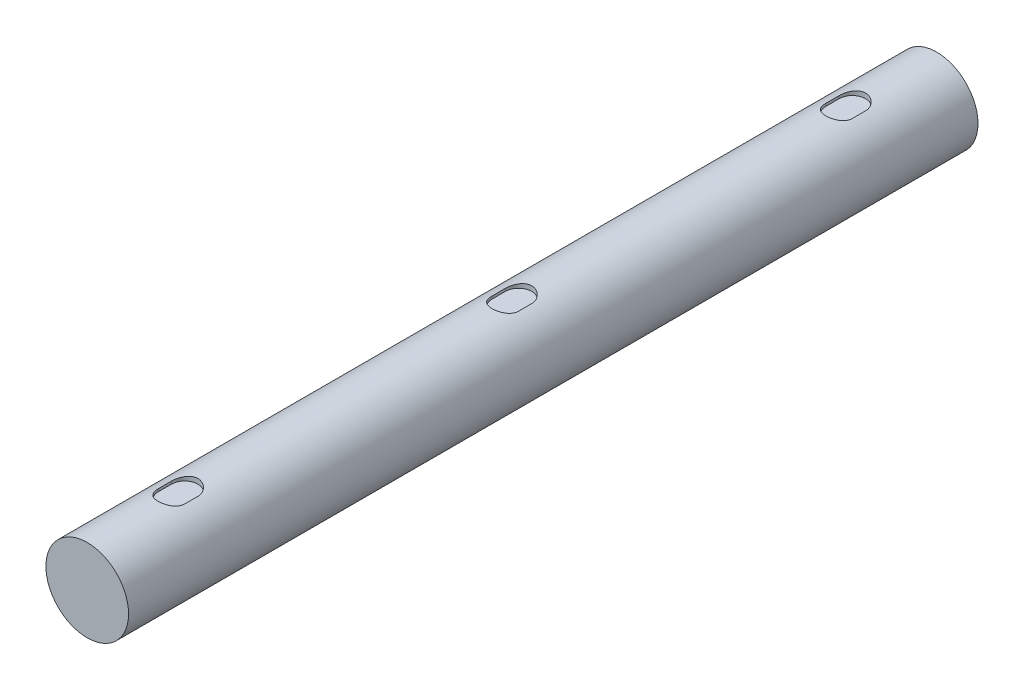
ISO-10303-21;
HEADER;
FILE_DESCRIPTION(('STEP AP214'),'2;1');
FILE_NAME('part.step','',(''),(''),'','','');
FILE_SCHEMA(('AUTOMOTIVE_DESIGN { 1 0 10303 214 1 1 1 1 }'));
ENDSEC;
DATA;
#1=APPLICATION_CONTEXT('core data for automotive mechanical design processes');
#2=APPLICATION_PROTOCOL_DEFINITION('international standard','automotive_design',2000,#1);
#3=PRODUCT_CONTEXT('',#1,'mechanical');
#4=PRODUCT('Part','Part','',(#3));
#5=PRODUCT_RELATED_PRODUCT_CATEGORY('part','',(#4));
#6=PRODUCT_DEFINITION_FORMATION('','',#4);
#7=PRODUCT_DEFINITION_CONTEXT('part definition',#1,'design');
#8=PRODUCT_DEFINITION('design','',#6,#7);
#9=PRODUCT_DEFINITION_SHAPE('','',#8);
#10=(LENGTH_UNIT() NAMED_UNIT(*) SI_UNIT(.MILLI.,.METRE.));
#11=(NAMED_UNIT(*) PLANE_ANGLE_UNIT() SI_UNIT($,.RADIAN.));
#12=(NAMED_UNIT(*) SI_UNIT($,.STERADIAN.) SOLID_ANGLE_UNIT());
#13=UNCERTAINTY_MEASURE_WITH_UNIT(LENGTH_MEASURE(1.E-05),#10,'distance_accuracy_value','');
#14=(GEOMETRIC_REPRESENTATION_CONTEXT(3) GLOBAL_UNCERTAINTY_ASSIGNED_CONTEXT((#13)) GLOBAL_UNIT_ASSIGNED_CONTEXT((#10,
#11,#12)) REPRESENTATION_CONTEXT('',''));
#15=CARTESIAN_POINT('',(0.,0.,0.));
#16=DIRECTION('',(0.,0.,1.));
#17=DIRECTION('',(1.,0.,0.));
#18=AXIS2_PLACEMENT_3D('',#15,#16,#17);
#19=CARTESIAN_POINT('',(0.,0.,257.));
#20=DIRECTION('',(0.,0.,-1.));
#21=DIRECTION('',(-1.,0.,0.));
#22=AXIS2_PLACEMENT_3D('',#19,#20,#21);
#23=CYLINDRICAL_SURFACE('',#22,12.5);
#24=CARTESIAN_POINT('',(0.,0.,0.));
#25=DIRECTION('',(0.,0.,1.));
#26=DIRECTION('',(1.,0.,0.));
#27=AXIS2_PLACEMENT_3D('',#24,#25,#26);
#28=CIRCLE('',#27,12.5);
#29=CARTESIAN_POINT('',(12.5,0.,0.));
#30=VERTEX_POINT('',#29);
#31=EDGE_CURVE('E169',#30,#30,#28,.T.);
#32=ORIENTED_EDGE('',*,*,#31,.T.);
#33=EDGE_LOOP('',(#32));
#34=FACE_BOUND('',#33,.T.);
#35=CARTESIAN_POINT('',(0.,0.,257.));
#36=DIRECTION('',(0.,0.,1.));
#37=DIRECTION('',(1.,0.,0.));
#38=AXIS2_PLACEMENT_3D('',#35,#36,#37);
#39=CIRCLE('',#38,12.5);
#40=CARTESIAN_POINT('',(12.5,0.,257.));
#41=VERTEX_POINT('',#40);
#42=EDGE_CURVE('E195',#41,#41,#39,.T.);
#43=ORIENTED_EDGE('',*,*,#42,.F.);
#44=EDGE_LOOP('',(#43));
#45=FACE_BOUND('',#44,.T.);
#46=CARTESIAN_POINT('',(-4.,11.842719282327,130.5));
#47=CARTESIAN_POINT('',(-4.00001410484613,11.8427027366058,130.609399771962));
#48=CARTESIAN_POINT('',(-3.995512175201,11.8442348052368,130.718790209848));
#49=CARTESIAN_POINT('',(-3.97758606678449,11.8502730910574,130.936728240737));
#50=CARTESIAN_POINT('',(-3.9641641287257,11.8547785613244,131.045276038485));
#51=CARTESIAN_POINT('',(-3.92855725119429,11.8666242076309,131.260461030845));
#52=CARTESIAN_POINT('',(-3.9063967602145,11.8739564736691,131.367102695611));
#53=CARTESIAN_POINT('',(-3.85353581488656,11.8912164993788,131.578005638372));
#54=CARTESIAN_POINT('',(-3.82283508754056,11.90114434202,131.682266840157));
#55=CARTESIAN_POINT('',(-3.71831764495513,11.9343840843196,131.990305004278));
#56=CARTESIAN_POINT('',(-3.63203544139889,11.9611699822066,132.189636552068));
#57=CARTESIAN_POINT('',(-3.4289502119229,12.0209583955878,132.571012557042));
#58=CARTESIAN_POINT('',(-3.31213030924912,12.0539643457894,132.75304737905));
#59=CARTESIAN_POINT('',(-3.04678507884792,12.123798407807,133.101253988599));
#60=CARTESIAN_POINT('',(-2.89735303896516,12.1607158548651,133.266718324339));
#61=CARTESIAN_POINT('',(-2.57296449846118,12.2334561140966,133.570714848589));
#62=CARTESIAN_POINT('',(-2.39800356343233,12.2692787347869,133.709242348358));
#63=CARTESIAN_POINT('',(-2.02237003010512,12.3368244653945,133.958615198371));
#64=CARTESIAN_POINT('',(-1.82118394546976,12.3684294972003,134.06872195647));
#65=CARTESIAN_POINT('',(-1.40197197350369,12.4229251649937,134.253249495349));
#66=CARTESIAN_POINT('',(-1.18395091903582,12.4458182908278,134.327680473782));
#67=CARTESIAN_POINT('',(-0.744713961063376,12.4796767811416,134.436358864251));
#68=CARTESIAN_POINT('',(-0.523827920101166,12.4910030499338,134.47182493338));
#69=CARTESIAN_POINT('',(-0.0789648151746458,12.5017287122873,134.505432799042));
#70=CARTESIAN_POINT('',(0.145011564197635,12.5011307063103,134.503582733525));
#71=CARTESIAN_POINT('',(0.58109497443769,12.4883236673358,134.463401170729));
#72=CARTESIAN_POINT('',(0.793338226675241,12.4765355800409,134.426392232021));
#73=CARTESIAN_POINT('',(1.20842320012721,12.443194578958,134.319119448394));
#74=CARTESIAN_POINT('',(1.41126440871778,12.4216411334261,134.248853792567));
#75=CARTESIAN_POINT('',(1.80478548808183,12.3706364987475,134.076242157764));
#76=CARTESIAN_POINT('',(1.99528012693527,12.3410893067347,133.973503480131));
#77=CARTESIAN_POINT('',(2.35673113106229,12.2771965403044,133.739170950955));
#78=CARTESIAN_POINT('',(2.52768253275751,12.2428497517893,133.607569793597));
#79=CARTESIAN_POINT('',(2.8530451152822,12.1712409097156,133.312553468708));
#80=CARTESIAN_POINT('',(3.00641313381737,12.1339170352569,133.148003297408));
#81=CARTESIAN_POINT('',(3.28377291775701,12.0618172896256,132.795028099915));
#82=CARTESIAN_POINT('',(3.40775562728565,12.0270422062066,132.606595741168));
#83=CARTESIAN_POINT('',(3.56958208232606,11.9796198433082,132.308628762251));
#84=CARTESIAN_POINT('',(3.61975674493764,11.9645161845072,132.206000940758));
#85=CARTESIAN_POINT('',(3.71123075156254,11.9364591580623,131.996595247248));
#86=CARTESIAN_POINT('',(3.75253376401033,11.9235049021446,131.889819112214));
#87=CARTESIAN_POINT('',(3.82585831579177,11.9001802342949,131.672986672108));
#88=CARTESIAN_POINT('',(3.85788979915527,11.889807055759,131.562934022027));
#89=CARTESIAN_POINT('',(3.91241790563963,11.8719756673203,131.340304843052));
#90=CARTESIAN_POINT('',(3.93491889994975,11.8645161211931,131.227729496203));
#91=CARTESIAN_POINT('',(3.96832908530803,11.8533815888388,131.012760754139));
#92=CARTESIAN_POINT('',(3.9802038456482,11.8493925948395,130.910532584205));
#93=CARTESIAN_POINT('',(3.99603937127681,11.8440568016292,130.705538921967));
#94=CARTESIAN_POINT('',(4.00001099551563,11.8427063770563,130.602774361719));
#95=CARTESIAN_POINT('',(4.,11.842719282327,130.5));
#96=B_SPLINE_CURVE_WITH_KNOTS('',3,(#46,#47,#48,#49,#50,#51,#52,#53,#54,#55,#56,#57,#58,#59,#60,
#61,#62,#63,#64,#65,#66,#67,#68,#69,#70,#71,#72,#73,#74,#75,#76,#77,#78,#79,#80,#81,#82,#83,#84,
#85,#86,#87,#88,#89,#90,#91,#92,#93,#94,#95),.UNSPECIFIED.,.F.,.F.,(4,2,2,2,2,2,2,2,2,2,2,2,2,2,
2,2,2,2,2,2,2,2,2,2,4),(0.,0.328080176984138,0.656077971124964,0.983164539368214,
1.31026156448799,1.96355293984241,2.61720612481379,3.29209427898753,3.96709980211696,
4.65819584662372,5.34909422856991,6.01770820975084,6.68617638029993,7.3304550155383,
7.97476873730064,8.62719320105812,9.27978300073407,9.96076419384898,10.6419549776067,
10.9872862883783,11.3324745283028,11.6772911585126,12.0219494657669,12.3305938648258,
12.6388138912331),.UNSPECIFIED.);
#97=CARTESIAN_POINT('',(-4.,11.842719282327,130.5));
#98=VERTEX_POINT('',#97);
#99=CARTESIAN_POINT('',(4.,11.842719282327,130.5));
#100=VERTEX_POINT('',#99);
#101=EDGE_CURVE('E198',#98,#100,#96,.T.);
#102=ORIENTED_EDGE('',*,*,#101,.F.);
#103=DIRECTION('',(0.,0.,-1.));
#104=VECTOR('',#103,1.);
#105=CARTESIAN_POINT('',(-3.99999999999997,11.842719282327,257.));
#106=LINE('',#105,#104);
#107=CARTESIAN_POINT('',(-4.,11.842719282327,126.5));
#108=VERTEX_POINT('',#107);
#109=EDGE_CURVE('E234',#98,#108,#106,.T.);
#110=ORIENTED_EDGE('',*,*,#109,.T.);
#111=CARTESIAN_POINT('',(4.,11.842719282327,126.5));
#112=CARTESIAN_POINT('',(4.00001410484613,11.8427027366058,126.390600228038));
#113=CARTESIAN_POINT('',(3.995512175201,11.8442348052368,126.281209790152));
#114=CARTESIAN_POINT('',(3.97758606678449,11.8502730910574,126.063271759263));
#115=CARTESIAN_POINT('',(3.9641641287257,11.8547785613244,125.954723961515));
#116=CARTESIAN_POINT('',(3.92855725119429,11.8666242076309,125.739538969154));
#117=CARTESIAN_POINT('',(3.90639676021449,11.8739564736692,125.632897304389));
#118=CARTESIAN_POINT('',(3.85353581488655,11.8912164993788,125.421994361628));
#119=CARTESIAN_POINT('',(3.82283508754055,11.90114434202,125.317733159843));
#120=CARTESIAN_POINT('',(3.71831764495512,11.9343840843196,125.009694995722));
#121=CARTESIAN_POINT('',(3.63203544139887,11.9611699822066,124.810363447932));
#122=CARTESIAN_POINT('',(3.42895021192288,12.0209583955878,124.428987442958));
#123=CARTESIAN_POINT('',(3.31213030924909,12.0539643457894,124.24695262095));
#124=CARTESIAN_POINT('',(3.0467850788479,12.123798407807,123.898746011401));
#125=CARTESIAN_POINT('',(2.89735303896514,12.1607158548651,123.733281675661));
#126=CARTESIAN_POINT('',(2.57296449846117,12.2334561140966,123.429285151411));
#127=CARTESIAN_POINT('',(2.39800356343233,12.2692787347869,123.290757651642));
#128=CARTESIAN_POINT('',(2.02237003010513,12.3368244653945,123.041384801629));
#129=CARTESIAN_POINT('',(1.82118394546977,12.3684294972003,122.93127804353));
#130=CARTESIAN_POINT('',(1.4019719735037,12.4229251649937,122.746750504651));
#131=CARTESIAN_POINT('',(1.18395091903582,12.4458182908278,122.672319526218));
#132=CARTESIAN_POINT('',(0.744713961063371,12.4796767811416,122.56364113575));
#133=CARTESIAN_POINT('',(0.523827920101163,12.4910030499338,122.52817506662));
#134=CARTESIAN_POINT('',(0.0789648151746441,12.5017287122873,122.494567200958));
#135=CARTESIAN_POINT('',(-0.145011564197637,12.5011307063103,122.496417266475));
#136=CARTESIAN_POINT('',(-0.581094974437685,12.4883236673358,122.536598829271));
#137=CARTESIAN_POINT('',(-0.793338226675229,12.4765355800409,122.573607767979));
#138=CARTESIAN_POINT('',(-1.2084232001272,12.443194578958,122.680880551606));
#139=CARTESIAN_POINT('',(-1.41126440871777,12.4216411334261,122.751146207433));
#140=CARTESIAN_POINT('',(-1.80478548808183,12.3706364987475,122.923757842236));
#141=CARTESIAN_POINT('',(-1.99528012693527,12.3410893067347,123.026496519869));
#142=CARTESIAN_POINT('',(-2.35673113106228,12.2771965403044,123.260829049045));
#143=CARTESIAN_POINT('',(-2.5276825327575,12.2428497517893,123.392430206403));
#144=CARTESIAN_POINT('',(-2.8530451152822,12.1712409097156,123.687446531292));
#145=CARTESIAN_POINT('',(-3.00641313381737,12.1339170352569,123.851996702592));
#146=CARTESIAN_POINT('',(-3.28377291775701,12.0618172896256,124.204971900085));
#147=CARTESIAN_POINT('',(-3.40775562728565,12.0270422062066,124.393404258832));
#148=CARTESIAN_POINT('',(-3.56958208232606,11.9796198433082,124.691371237749));
#149=CARTESIAN_POINT('',(-3.61975674493764,11.9645161845072,124.793999059242));
#150=CARTESIAN_POINT('',(-3.71123075156254,11.9364591580623,125.003404752752));
#151=CARTESIAN_POINT('',(-3.75253376401033,11.9235049021446,125.110180887786));
#152=CARTESIAN_POINT('',(-3.82585831579178,11.9001802342949,125.327013327892));
#153=CARTESIAN_POINT('',(-3.85788979915528,11.889807055759,125.437065977973));
#154=CARTESIAN_POINT('',(-3.91241790563964,11.8719756673203,125.659695156948));
#155=CARTESIAN_POINT('',(-3.93491889994975,11.8645161211931,125.772270503797));
#156=CARTESIAN_POINT('',(-3.96832908530803,11.8533815888388,125.987239245861));
#157=CARTESIAN_POINT('',(-3.9802038456482,11.8493925948395,126.089467415795));
#158=CARTESIAN_POINT('',(-3.99603937127681,11.8440568016292,126.294461078033));
#159=CARTESIAN_POINT('',(-4.00001099551563,11.8427063770563,126.397225638281));
#160=CARTESIAN_POINT('',(-4.,11.842719282327,126.5));
#161=B_SPLINE_CURVE_WITH_KNOTS('',3,(#111,#112,#113,#114,#115,#116,#117,#118,#119,#120,#121,
#122,#123,#124,#125,#126,#127,#128,#129,#130,#131,#132,#133,#134,#135,#136,#137,#138,#139,#140,
#141,#142,#143,#144,#145,#146,#147,#148,#149,#150,#151,#152,#153,#154,#155,#156,#157,#158,#159,
#160),.UNSPECIFIED.,.F.,.F.,(4,2,2,2,2,2,2,2,2,2,2,2,2,2,2,2,2,2,2,2,2,2,2,2,4),(0.,
0.328080176984138,0.656077971124964,0.983164539368271,1.31026156448799,1.96355293984249,
2.61720612481382,3.29209427898755,3.96709980211696,4.65819584662372,5.34909422856992,
6.01770820975085,6.68617638029993,7.33045501553829,7.97476873730064,8.62719320105811,
9.27978300073407,9.96076419384898,10.6419549776068,10.9872862883783,11.3324745283028,
11.6772911585126,12.0219494657669,12.3305938648259,12.6388138912331),.UNSPECIFIED.);
#162=CARTESIAN_POINT('',(4.,11.842719282327,126.5));
#163=VERTEX_POINT('',#162);
#164=EDGE_CURVE('E228',#163,#108,#161,.T.);
#165=ORIENTED_EDGE('',*,*,#164,.F.);
#166=DIRECTION('',(0.,0.,-1.));
#167=VECTOR('',#166,1.);
#168=CARTESIAN_POINT('',(4.00000000000003,11.842719282327,257.));
#169=LINE('',#168,#167);
#170=EDGE_CURVE('E207',#100,#163,#169,.T.);
#171=ORIENTED_EDGE('',*,*,#170,.F.);
#172=EDGE_LOOP('',(#102,#110,#165,#171));
#173=FACE_BOUND('',#172,.T.);
#174=CARTESIAN_POINT('',(-4.,11.842719282327,25.5));
#175=CARTESIAN_POINT('',(-4.00001410484613,11.8427027366058,25.3906002280384));
#176=CARTESIAN_POINT('',(-3.995512175201,11.8442348052368,25.2812097901521));
#177=CARTESIAN_POINT('',(-3.97758606678449,11.8502730910574,25.0632717592635));
#178=CARTESIAN_POINT('',(-3.96416412872571,11.8547785613244,24.9547239615155));
#179=CARTESIAN_POINT('',(-3.92855725119429,11.8666242076309,24.7395389691545));
#180=CARTESIAN_POINT('',(-3.9063967602145,11.8739564736691,24.6328973043888));
#181=CARTESIAN_POINT('',(-3.85353581488656,11.8912164993788,24.4219943616284));
#182=CARTESIAN_POINT('',(-3.82283508754056,11.90114434202,24.3177331598432));
#183=CARTESIAN_POINT('',(-3.71831764495512,11.9343840843196,24.0096949957216));
#184=CARTESIAN_POINT('',(-3.63203544139887,11.9611699822066,23.810363447932));
#185=CARTESIAN_POINT('',(-3.42895021192288,12.0209583955878,23.4289874429582));
#186=CARTESIAN_POINT('',(-3.31213030924909,12.0539643457894,23.2469526209503));
#187=CARTESIAN_POINT('',(-3.0467850788479,12.123798407807,22.8987460114008));
#188=CARTESIAN_POINT('',(-2.89735303896514,12.1607158548651,22.7332816756605));
#189=CARTESIAN_POINT('',(-2.57296449846116,12.2334561140966,22.4292851514111));
#190=CARTESIAN_POINT('',(-2.39800356343232,12.2692787347869,22.2907576516423));
#191=CARTESIAN_POINT('',(-2.02237003010512,12.3368244653945,22.0413848016295));
#192=CARTESIAN_POINT('',(-1.82118394546976,12.3684294972003,21.9312780435304));
#193=CARTESIAN_POINT('',(-1.40197197350368,12.4229251649937,21.7467505046506));
#194=CARTESIAN_POINT('',(-1.18395091903581,12.4458182908278,21.6723195262181));
#195=CARTESIAN_POINT('',(-0.744713961063363,12.4796767811416,21.5636411357495));
#196=CARTESIAN_POINT('',(-0.523827920101154,12.4910030499338,21.5281750666199));
#197=CARTESIAN_POINT('',(-0.0789648151746366,12.5017287122873,21.4945672009584));
#198=CARTESIAN_POINT('',(0.145011564197643,12.5011307063103,21.4964172664752));
#199=CARTESIAN_POINT('',(0.581094974437693,12.4883236673358,21.5365988292713));
#200=CARTESIAN_POINT('',(0.793338226675239,12.4765355800409,21.5736077679788));
#201=CARTESIAN_POINT('',(1.2084232001272,12.443194578958,21.6808805516063));
#202=CARTESIAN_POINT('',(1.41126440871778,12.4216411334261,21.7511462074328));
#203=CARTESIAN_POINT('',(1.80478548808183,12.3706364987475,21.9237578422358));
#204=CARTESIAN_POINT('',(1.99528012693527,12.3410893067347,22.0264965198688));
#205=CARTESIAN_POINT('',(2.35673113106229,12.2771965403044,22.2608290490452));
#206=CARTESIAN_POINT('',(2.5276825327575,12.2428497517893,22.392430206403));
#207=CARTESIAN_POINT('',(2.85304511528221,12.1712409097156,22.6874465312916));
#208=CARTESIAN_POINT('',(3.00641313381737,12.1339170352569,22.8519967025921));
#209=CARTESIAN_POINT('',(3.28377291775701,12.0618172896256,23.2049719000853));
#210=CARTESIAN_POINT('',(3.40775562728565,12.0270422062066,23.3934042588321));
#211=CARTESIAN_POINT('',(3.56958208232607,11.9796198433082,23.6913712377486));
#212=CARTESIAN_POINT('',(3.61975674493765,11.9645161845072,23.7939990592415));
#213=CARTESIAN_POINT('',(3.71123075156255,11.9364591580623,24.0034047527517));
#214=CARTESIAN_POINT('',(3.75253376401034,11.9235049021446,24.1101808877864));
#215=CARTESIAN_POINT('',(3.82585831579179,11.9001802342949,24.3270133278916));
#216=CARTESIAN_POINT('',(3.85788979915529,11.889807055759,24.4370659779731));
#217=CARTESIAN_POINT('',(3.91241790563964,11.8719756673203,24.6596951569476));
#218=CARTESIAN_POINT('',(3.93491889994975,11.8645161211931,24.7722705037974));
#219=CARTESIAN_POINT('',(3.96832908530803,11.8533815888388,24.987239245861));
#220=CARTESIAN_POINT('',(3.9802038456482,11.8493925948395,25.0894674157946));
#221=CARTESIAN_POINT('',(3.99603937127681,11.8440568016292,25.2944610780333));
#222=CARTESIAN_POINT('',(4.00001099551563,11.8427063770563,25.3972256382805));
#223=CARTESIAN_POINT('',(4.,11.842719282327,25.5));
#224=B_SPLINE_CURVE_WITH_KNOTS('',3,(#174,#175,#176,#177,#178,#179,#180,#181,#182,#183,#184,
#185,#186,#187,#188,#189,#190,#191,#192,#193,#194,#195,#196,#197,#198,#199,#200,#201,#202,#203,
#204,#205,#206,#207,#208,#209,#210,#211,#212,#213,#214,#215,#216,#217,#218,#219,#220,#221,#222,
#223),.UNSPECIFIED.,.F.,.F.,(4,2,2,2,2,2,2,2,2,2,2,2,2,2,2,2,2,2,2,2,2,2,2,2,4),(0.,
0.328080176984104,0.656077971124949,0.98316453936822,1.310261564488,1.96355293984248,
2.61720612481382,3.29209427898756,3.96709980211697,4.65819584662373,5.34909422856993,
6.01770820975085,6.68617638029993,7.3304550155383,7.97476873730064,8.6271932010581,
9.27978300073407,9.96076419384897,10.6419549776068,10.9872862883783,11.3324745283028,
11.6772911585126,12.0219494657669,12.3305938648259,12.6388138912331),.UNSPECIFIED.);
#225=CARTESIAN_POINT('',(-4.,11.842719282327,25.5));
#226=VERTEX_POINT('',#225);
#227=CARTESIAN_POINT('',(4.,11.842719282327,25.5));
#228=VERTEX_POINT('',#227);
#229=EDGE_CURVE('E237',#226,#228,#224,.T.);
#230=ORIENTED_EDGE('',*,*,#229,.T.);
#231=DIRECTION('',(0.,0.,-1.));
#232=VECTOR('',#231,1.);
#233=CARTESIAN_POINT('',(4.,11.842719282327,257.));
#234=LINE('',#233,#232);
#235=CARTESIAN_POINT('',(4.,11.842719282327,29.5));
#236=VERTEX_POINT('',#235);
#237=EDGE_CURVE('E286',#228,#236,#234,.F.);
#238=ORIENTED_EDGE('',*,*,#237,.T.);
#239=CARTESIAN_POINT('',(4.,11.842719282327,29.5));
#240=CARTESIAN_POINT('',(4.00001410484613,11.8427027366058,29.6093997719616));
#241=CARTESIAN_POINT('',(3.995512175201,11.8442348052368,29.7187902098479));
#242=CARTESIAN_POINT('',(3.97758606678449,11.8502730910574,29.9367282407365));
#243=CARTESIAN_POINT('',(3.96416412872571,11.8547785613244,30.0452760384845));
#244=CARTESIAN_POINT('',(3.92855725119429,11.8666242076309,30.2604610308455));
#245=CARTESIAN_POINT('',(3.9063967602145,11.8739564736691,30.3671026956112));
#246=CARTESIAN_POINT('',(3.85353581488657,11.8912164993788,30.5780056383716));
#247=CARTESIAN_POINT('',(3.82283508754056,11.90114434202,30.6822668401568));
#248=CARTESIAN_POINT('',(3.71831764495512,11.9343840843196,30.9903050042784));
#249=CARTESIAN_POINT('',(3.63203544139888,11.9611699822066,31.189636552068));
#250=CARTESIAN_POINT('',(3.42895021192288,12.0209583955878,31.5710125570418));
#251=CARTESIAN_POINT('',(3.3121303092491,12.0539643457894,31.7530473790497));
#252=CARTESIAN_POINT('',(3.0467850788479,12.123798407807,32.1012539885992));
#253=CARTESIAN_POINT('',(2.89735303896514,12.1607158548651,32.2667183243395));
#254=CARTESIAN_POINT('',(2.57296449846116,12.2334561140966,32.5707148485889));
#255=CARTESIAN_POINT('',(2.39800356343233,12.2692787347869,32.7092423483577));
#256=CARTESIAN_POINT('',(2.02237003010512,12.3368244653945,32.9586151983705));
#257=CARTESIAN_POINT('',(1.82118394546977,12.3684294972003,33.0687219564696));
#258=CARTESIAN_POINT('',(1.40197197350369,12.4229251649937,33.2532494953494));
#259=CARTESIAN_POINT('',(1.18395091903581,12.4458182908278,33.3276804737819));
#260=CARTESIAN_POINT('',(0.744713961063364,12.4796767811416,33.4363588642505));
#261=CARTESIAN_POINT('',(0.523827920101156,12.4910030499338,33.4718249333801));
#262=CARTESIAN_POINT('',(0.0789648151746394,12.5017287122873,33.5054327990416));
#263=CARTESIAN_POINT('',(-0.14501156419764,12.5011307063103,33.5035827335248));
#264=CARTESIAN_POINT('',(-0.58109497443769,12.4883236673358,33.4634011707287));
#265=CARTESIAN_POINT('',(-0.793338226675237,12.4765355800409,33.4263922320212));
#266=CARTESIAN_POINT('',(-1.2084232001272,12.443194578958,33.3191194483937));
#267=CARTESIAN_POINT('',(-1.41126440871778,12.4216411334261,33.2488537925672));
#268=CARTESIAN_POINT('',(-1.80478548808183,12.3706364987475,33.0762421577642));
#269=CARTESIAN_POINT('',(-1.99528012693527,12.3410893067347,32.9735034801312));
#270=CARTESIAN_POINT('',(-2.35673113106228,12.2771965403044,32.7391709509548));
#271=CARTESIAN_POINT('',(-2.5276825327575,12.2428497517893,32.607569793597));
#272=CARTESIAN_POINT('',(-2.8530451152822,12.1712409097156,32.3125534687084));
#273=CARTESIAN_POINT('',(-3.00641313381737,12.1339170352569,32.1480032974079));
#274=CARTESIAN_POINT('',(-3.28377291775701,12.0618172896256,31.7950280999147));
#275=CARTESIAN_POINT('',(-3.40775562728565,12.0270422062066,31.6065957411679));
#276=CARTESIAN_POINT('',(-3.56958208232607,11.9796198433082,31.3086287622514));
#277=CARTESIAN_POINT('',(-3.61975674493765,11.9645161845072,31.2060009407585));
#278=CARTESIAN_POINT('',(-3.71123075156255,11.9364591580623,30.9965952472483));
#279=CARTESIAN_POINT('',(-3.75253376401034,11.9235049021446,30.8898191122136));
#280=CARTESIAN_POINT('',(-3.82585831579179,11.9001802342949,30.6729866721084));
#281=CARTESIAN_POINT('',(-3.85788979915529,11.889807055759,30.5629340220269));
#282=CARTESIAN_POINT('',(-3.91241790563964,11.8719756673203,30.3403048430524));
#283=CARTESIAN_POINT('',(-3.93491889994975,11.8645161211931,30.2277294962026));
#284=CARTESIAN_POINT('',(-3.96832908530803,11.8533815888388,30.012760754139));
#285=CARTESIAN_POINT('',(-3.9802038456482,11.8493925948395,29.9105325842054));
#286=CARTESIAN_POINT('',(-3.99603937127681,11.8440568016292,29.7055389219667));
#287=CARTESIAN_POINT('',(-4.00001099551563,11.8427063770563,29.6027743617195));
#288=CARTESIAN_POINT('',(-4.,11.842719282327,29.5));
#289=B_SPLINE_CURVE_WITH_KNOTS('',3,(#239,#240,#241,#242,#243,#244,#245,#246,#247,#248,#249,
#250,#251,#252,#253,#254,#255,#256,#257,#258,#259,#260,#261,#262,#263,#264,#265,#266,#267,#268,
#269,#270,#271,#272,#273,#274,#275,#276,#277,#278,#279,#280,#281,#282,#283,#284,#285,#286,#287,
#288),.UNSPECIFIED.,.F.,.F.,(4,2,2,2,2,2,2,2,2,2,2,2,2,2,2,2,2,2,2,2,2,2,2,2,4),(0.,
0.3280801769841,0.656077971124946,0.983164539368217,1.31026156448799,1.96355293984247,
2.61720612481382,3.29209427898755,3.96709980211696,4.65819584662373,5.34909422856993,
6.01770820975085,6.68617638029993,7.3304550155383,7.97476873730064,8.6271932010581,
9.27978300073407,9.96076419384897,10.6419549776068,10.9872862883783,11.3324745283028,
11.6772911585126,12.0219494657669,12.3305938648259,12.6388138912331),.UNSPECIFIED.);
#290=CARTESIAN_POINT('',(-4.,11.842719282327,29.5));
#291=VERTEX_POINT('',#290);
#292=EDGE_CURVE('E289',#236,#291,#289,.T.);
#293=ORIENTED_EDGE('',*,*,#292,.T.);
#294=DIRECTION('',(0.,0.,-1.));
#295=VECTOR('',#294,1.);
#296=CARTESIAN_POINT('',(-4.,11.842719282327,257.));
#297=LINE('',#296,#295);
#298=EDGE_CURVE('E245',#226,#291,#297,.F.);
#299=ORIENTED_EDGE('',*,*,#298,.F.);
#300=EDGE_LOOP('',(#230,#238,#293,#299));
#301=FACE_BOUND('',#300,.T.);
#302=DIRECTION('',(0.,0.,-1.));
#303=VECTOR('',#302,1.);
#304=CARTESIAN_POINT('',(4.,11.842719282327,257.));
#305=LINE('',#304,#303);
#306=CARTESIAN_POINT('',(4.,11.842719282327,231.5));
#307=VERTEX_POINT('',#306);
#308=CARTESIAN_POINT('',(4.,11.842719282327,227.5));
#309=VERTEX_POINT('',#308);
#310=EDGE_CURVE('E11',#307,#309,#305,.T.);
#311=ORIENTED_EDGE('',*,*,#310,.F.);
#312=CARTESIAN_POINT('',(0.,12.5,235.5));
#313=CARTESIAN_POINT('',(0.218739515789949,12.4999994635907,235.499999390874));
#314=CARTESIAN_POINT('',(0.437486592647652,12.4942046039089,235.481998511802));
#315=CARTESIAN_POINT('',(0.868567253093705,12.4716565543057,235.410670451177));
#316=CARTESIAN_POINT('',(1.08089965843427,12.454901363839,235.357336820455));
#317=CARTESIAN_POINT('',(1.49287306447891,12.4122595908852,235.217337696971));
#318=CARTESIAN_POINT('',(1.69253368346149,12.3863875511298,235.130725269074));
#319=CARTESIAN_POINT('',(2.0744969071279,12.3281725410718,234.926857924782));
#320=CARTESIAN_POINT('',(2.25679651756237,12.2958284575098,234.809597735586));
#321=CARTESIAN_POINT('',(2.60473689448744,12.2269266983455,234.54378971624));
#322=CARTESIAN_POINT('',(2.76974023061599,12.1902739433225,234.394432252616));
#323=CARTESIAN_POINT('',(3.07283559233071,12.1174266425772,234.070392333632));
#324=CARTESIAN_POINT('',(3.21092229484498,12.0812321888099,233.895704880863));
#325=CARTESIAN_POINT('',(3.45978487684573,12.012370269974,233.520367863724));
#326=CARTESIAN_POINT('',(3.56975307774838,11.9798196408788,233.319159296823));
#327=CARTESIAN_POINT('',(3.75402292836496,11.9233664449728,232.899894140575));
#328=CARTESIAN_POINT('',(3.82833449433394,11.8994614742253,232.681842255031));
#329=CARTESIAN_POINT('',(3.93682835778228,11.8640030689908,232.242293481816));
#330=CARTESIAN_POINT('',(3.97219742115686,11.8520853732299,232.021119745614));
#331=CARTESIAN_POINT('',(4.00551082647404,11.8408707762137,231.575681002044));
#332=CARTESIAN_POINT('',(4.00346567735333,11.8415703310132,231.35141688039));
#333=CARTESIAN_POINT('',(3.96293451839878,11.8551904771854,230.916086037751));
#334=CARTESIAN_POINT('',(3.92597105327877,11.8676004346024,230.704858866299));
#335=CARTESIAN_POINT('',(3.81912647431514,11.9024114349979,230.29177788886));
#336=CARTESIAN_POINT('',(3.74924170672462,11.9248135869381,230.089925126017));
#337=CARTESIAN_POINT('',(3.57749112898224,11.9774663544073,229.697755352963));
#338=CARTESIAN_POINT('',(3.47515682759627,12.0078307368189,229.507659450129));
#339=CARTESIAN_POINT('',(3.24173735834849,12.0729361214443,229.146844892426));
#340=CARTESIAN_POINT('',(3.110644420678,12.1076783053403,228.976131493139));
#341=CARTESIAN_POINT('',(2.8160137885106,12.1796593035711,228.650338317836));
#342=CARTESIAN_POINT('',(2.65122340623531,12.216938020211,228.496398057654));
#343=CARTESIAN_POINT('',(2.29770358054263,12.2883292028654,228.218053304415));
#344=CARTESIAN_POINT('',(2.10897218913167,12.3224414108409,228.093651217143));
#345=CARTESIAN_POINT('',(1.710653951781,12.3840447436164,227.8770913918));
#346=CARTESIAN_POINT('',(1.50090319860161,12.411477013699,227.785217247909));
#347=CARTESIAN_POINT('',(1.06783962590281,12.4562040275044,227.638401008343));
#348=CARTESIAN_POINT('',(0.844531157828867,12.4735020051158,227.583447130458));
#349=CARTESIAN_POINT('',(0.400354473973302,12.4954856059785,227.513999833337));
#350=CARTESIAN_POINT('',(0.179750715042687,12.5006515044539,227.497964815972));
#351=CARTESIAN_POINT('',(-0.261025673970267,12.4992163829611,227.502448045553));
#352=CARTESIAN_POINT('',(-0.481198365218603,12.4926171751051,227.522960663275));
#353=CARTESIAN_POINT('',(-0.908837545509531,12.4687095079374,227.598725282703));
#354=CARTESIAN_POINT('',(-1.11648590619505,12.4516871662316,227.653049775215));
#355=CARTESIAN_POINT('',(-1.51965413650145,12.4089396498837,227.793754498491));
#356=CARTESIAN_POINT('',(-1.71517248448531,12.3832133859887,227.880138741505));
#357=CARTESIAN_POINT('',(-2.09399230967611,12.3248882754976,228.084927542945));
#358=CARTESIAN_POINT('',(-2.27686405125241,12.2921331567523,228.204081279856));
#359=CARTESIAN_POINT('',(-2.62052875751654,12.223485206012,228.470134682464));
#360=CARTESIAN_POINT('',(-2.78131543888496,12.187591485802,228.617042216146));
#361=CARTESIAN_POINT('',(-3.08320803721589,12.1148241820809,228.941685399027));
#362=CARTESIAN_POINT('',(-3.22321448689052,12.0779721041684,229.120450669221));
#363=CARTESIAN_POINT('',(-3.47135354981424,12.0090110777536,229.499736686146));
#364=CARTESIAN_POINT('',(-3.57948642564105,11.9769020901785,229.700257253635));
#365=CARTESIAN_POINT('',(-3.76018950753079,11.9214065721644,230.11710894664));
#366=CARTESIAN_POINT('',(-3.83287665768614,11.8979914205013,230.333385337474));
#367=CARTESIAN_POINT('',(-3.94051670615502,11.8627820424832,230.776018024526));
#368=CARTESIAN_POINT('',(-3.97548487516417,11.8509831134183,231.00237020284));
#369=CARTESIAN_POINT('',(-4.00556338278915,11.8408481974692,231.44718992291));
#370=CARTESIAN_POINT('',(-4.00248471115016,11.8419004772846,231.665522528322));
#371=CARTESIAN_POINT('',(-3.96095887873426,11.8558539773436,232.098392513587));
#372=CARTESIAN_POINT('',(-3.92251352152802,11.8687545933658,232.312930086403));
#373=CARTESIAN_POINT('',(-3.81258331041152,11.9045135786104,232.728708563442));
#374=CARTESIAN_POINT('',(-3.74164069856765,11.9272081809191,232.930107997232));
#375=CARTESIAN_POINT('',(-3.56916068710954,11.979949389859,233.318304401002));
#376=CARTESIAN_POINT('',(-3.46761685286564,12.009997542498,233.505098289407));
#377=CARTESIAN_POINT('',(-3.2319816676858,12.0755873592094,233.867024074536));
#378=CARTESIAN_POINT('',(-3.09673271078946,12.111302976317,234.041370656835));
#379=CARTESIAN_POINT('',(-2.79953499482211,12.1834295211838,234.365479364552));
#380=CARTESIAN_POINT('',(-2.63757895417057,12.2198406361674,234.515234762997));
#381=CARTESIAN_POINT('',(-2.28478052574588,12.2907777050029,234.79114571481));
#382=CARTESIAN_POINT('',(-2.09312837940195,12.3251937970096,234.916297379711));
#383=CARTESIAN_POINT('',(-1.69040882481734,12.3868446924465,235.132450470243));
#384=CARTESIAN_POINT('',(-1.47934815802039,12.4140819767823,235.223463698302));
#385=CARTESIAN_POINT('',(-1.05915857911211,12.4567085266016,235.363119449576));
#386=CARTESIAN_POINT('',(-0.850941916218329,12.4727975325363,235.414296126458));
#387=CARTESIAN_POINT('',(-0.428485002690303,12.4944423385348,235.48273285726));
#388=CARTESIAN_POINT('',(-0.214246128153489,12.5000005253903,235.500000596614));
#389=CARTESIAN_POINT('',(0.,12.5,235.5));
#390=B_SPLINE_CURVE_WITH_KNOTS('',3,(#312,#313,#314,#315,#316,#317,#318,#319,#320,#321,#322,
#323,#324,#325,#326,#327,#328,#329,#330,#331,#332,#333,#334,#335,#336,#337,#338,#339,#340,#341,
#342,#343,#344,#345,#346,#347,#348,#349,#350,#351,#352,#353,#354,#355,#356,#357,#358,#359,#360,
#361,#362,#363,#364,#365,#366,#367,#368,#369,#370,#371,#372,#373,#374,#375,#376,#377,#378,#379,
#380,#381,#382,#383,#384,#385,#386,#387,#388,#389),.UNSPECIFIED.,.T.,.F.,(4,2,2,2,2,2,2,2,2,2,2,
2,2,2,2,2,2,2,2,2,2,2,2,2,2,2,2,2,2,2,2,2,2,2,2,2,2,2,4),(0.,0.655430724666217,1.31098111587091,
1.96549050527929,2.62011257411757,3.29374295378917,3.96750641671064,4.65887072066567,
5.35004264179886,6.01951224998766,6.68879381985559,7.330177233813,7.97163184802041,
8.62280489842002,9.27415409537616,9.95668212026651,10.6392657156648,11.3276617834058,
12.0158380617097,12.6762752648346,13.3366107533684,13.9795854097457,14.6226405610093,
15.281833876428,15.9412143491714,16.6280748263774,17.3149296449995,17.9995027669286,
18.6837986322708,19.3356533743721,19.9874748761257,20.6287955720838,21.2702512150686,
21.937843916949,22.6056189371905,23.2966571383325,23.9874562112942,24.6295685076846,
25.2715352530413),.UNSPECIFIED.);
#391=CARTESIAN_POINT('',(-4.,11.842719282327,231.5));
#392=VERTEX_POINT('',#391);
#393=EDGE_CURVE('E44',#392,#307,#390,.T.);
#394=ORIENTED_EDGE('',*,*,#393,.F.);
#395=DIRECTION('',(0.,0.,-1.));
#396=VECTOR('',#395,1.);
#397=CARTESIAN_POINT('',(-4.,11.842719282327,257.));
#398=LINE('',#397,#396);
#399=CARTESIAN_POINT('',(-4.,11.842719282327,227.5));
#400=VERTEX_POINT('',#399);
#401=EDGE_CURVE('E285',#392,#400,#398,.T.);
#402=ORIENTED_EDGE('',*,*,#401,.T.);
#403=CARTESIAN_POINT('',(4.,11.842719282327,227.5));
#404=CARTESIAN_POINT('',(4.00001410484613,11.8427027366058,227.390600228038));
#405=CARTESIAN_POINT('',(3.995512175201,11.8442348052368,227.281209790152));
#406=CARTESIAN_POINT('',(3.97758606678449,11.8502730910574,227.063271759264));
#407=CARTESIAN_POINT('',(3.96416412872571,11.8547785613244,226.954723961516));
#408=CARTESIAN_POINT('',(3.9285572511943,11.8666242076309,226.739538969155));
#409=CARTESIAN_POINT('',(3.9063967602145,11.8739564736691,226.632897304389));
#410=CARTESIAN_POINT('',(3.85353581488657,11.8912164993788,226.421994361628));
#411=CARTESIAN_POINT('',(3.82283508754056,11.90114434202,226.317733159843));
#412=CARTESIAN_POINT('',(3.71831764495512,11.9343840843196,226.009694995722));
#413=CARTESIAN_POINT('',(3.63203544139887,11.9611699822066,225.810363447932));
#414=CARTESIAN_POINT('',(3.42895021192287,12.0209583955878,225.428987442958));
#415=CARTESIAN_POINT('',(3.3121303092491,12.0539643457894,225.24695262095));
#416=CARTESIAN_POINT('',(3.04678507884792,12.123798407807,224.898746011401));
#417=CARTESIAN_POINT('',(2.89735303896515,12.1607158548651,224.733281675661));
#418=CARTESIAN_POINT('',(2.57296449846117,12.2334561140966,224.429285151411));
#419=CARTESIAN_POINT('',(2.39800356343233,12.2692787347869,224.290757651642));
#420=CARTESIAN_POINT('',(2.02237003010512,12.3368244653945,224.041384801629));
#421=CARTESIAN_POINT('',(1.82118394546976,12.3684294972003,223.93127804353));
#422=CARTESIAN_POINT('',(1.40197197350369,12.4229251649937,223.746750504651));
#423=CARTESIAN_POINT('',(1.18395091903582,12.4458182908278,223.672319526218));
#424=CARTESIAN_POINT('',(0.744713961063376,12.4796767811416,223.563641135749));
#425=CARTESIAN_POINT('',(0.523827920101166,12.4910030499338,223.52817506662));
#426=CARTESIAN_POINT('',(0.0789648151746457,12.5017287122873,223.494567200958));
#427=CARTESIAN_POINT('',(-0.145011564197635,12.5011307063103,223.496417266475));
#428=CARTESIAN_POINT('',(-0.581094974437688,12.4883236673358,223.536598829271));
#429=CARTESIAN_POINT('',(-0.793338226675237,12.4765355800409,223.573607767979));
#430=CARTESIAN_POINT('',(-1.2084232001272,12.443194578958,223.680880551606));
#431=CARTESIAN_POINT('',(-1.41126440871777,12.4216411334261,223.751146207433));
#432=CARTESIAN_POINT('',(-1.80478548808182,12.3706364987475,223.923757842236));
#433=CARTESIAN_POINT('',(-1.99528012693527,12.3410893067347,224.026496519869));
#434=CARTESIAN_POINT('',(-2.35673113106229,12.2771965403044,224.260829049045));
#435=CARTESIAN_POINT('',(-2.5276825327575,12.2428497517893,224.392430206403));
#436=CARTESIAN_POINT('',(-2.8530451152822,12.1712409097156,224.687446531292));
#437=CARTESIAN_POINT('',(-3.00641313381736,12.1339170352569,224.851996702592));
#438=CARTESIAN_POINT('',(-3.283772917757,12.0618172896256,225.204971900085));
#439=CARTESIAN_POINT('',(-3.40775562728565,12.0270422062066,225.393404258832));
#440=CARTESIAN_POINT('',(-3.56958208232606,11.9796198433082,225.691371237749));
#441=CARTESIAN_POINT('',(-3.61975674493764,11.9645161845072,225.793999059242));
#442=CARTESIAN_POINT('',(-3.71123075156255,11.9364591580623,226.003404752752));
#443=CARTESIAN_POINT('',(-3.75253376401034,11.9235049021446,226.110180887786));
#444=CARTESIAN_POINT('',(-3.82585831579178,11.9001802342949,226.327013327892));
#445=CARTESIAN_POINT('',(-3.85788979915528,11.889807055759,226.437065977973));
#446=CARTESIAN_POINT('',(-3.91241790563964,11.8719756673203,226.659695156948));
#447=CARTESIAN_POINT('',(-3.93491889994975,11.8645161211931,226.772270503797));
#448=CARTESIAN_POINT('',(-3.96832908530803,11.8533815888388,226.987239245861));
#449=CARTESIAN_POINT('',(-3.9802038456482,11.8493925948395,227.089467415795));
#450=CARTESIAN_POINT('',(-3.99603937127681,11.8440568016292,227.294461078033));
#451=CARTESIAN_POINT('',(-4.00001099551563,11.8427063770563,227.397225638281));
#452=CARTESIAN_POINT('',(-4.,11.842719282327,227.5));
#453=B_SPLINE_CURVE_WITH_KNOTS('',3,(#403,#404,#405,#406,#407,#408,#409,#410,#411,#412,#413,
#414,#415,#416,#417,#418,#419,#420,#421,#422,#423,#424,#425,#426,#427,#428,#429,#430,#431,#432,
#433,#434,#435,#436,#437,#438,#439,#440,#441,#442,#443,#444,#445,#446,#447,#448,#449,#450,#451,
#452),.UNSPECIFIED.,.F.,.F.,(4,2,2,2,2,2,2,2,2,2,2,2,2,2,2,2,2,2,2,2,2,2,2,2,4),(0.,
0.328080176984111,0.656077971124936,0.983164539368185,1.31026156448799,1.96355293984251,
2.61720612481379,3.29209427898754,3.96709980211696,4.65819584662372,5.34909422856991,
6.01770820975084,6.68617638029993,7.33045501553829,7.97476873730064,8.62719320105809,
9.27978300073407,9.96076419384895,10.6419549776067,10.9872862883783,11.3324745283028,
11.6772911585126,12.0219494657669,12.3305938648258,12.6388138912331),.UNSPECIFIED.);
#454=EDGE_CURVE('E284',#309,#400,#453,.T.);
#455=ORIENTED_EDGE('',*,*,#454,.F.);
#456=EDGE_LOOP('',(#311,#394,#402,#455));
#457=FACE_BOUND('',#456,.T.);
#458=ADVANCED_FACE('F36',(#34,#45,#173,#301,#457),#23,.T.);
#459=CARTESIAN_POINT('',(0.,0.,257.));
#460=DIRECTION('',(0.,0.,1.));
#461=DIRECTION('',(1.,0.,0.));
#462=AXIS2_PLACEMENT_3D('',#459,#460,#461);
#463=PLANE('',#462);
#464=ORIENTED_EDGE('',*,*,#42,.T.);
#465=EDGE_LOOP('',(#464));
#466=FACE_BOUND('',#465,.T.);
#467=ADVANCED_FACE('F265',(#466),#463,.T.);
#468=CARTESIAN_POINT('',(0.,0.,0.));
#469=DIRECTION('',(0.,0.,1.));
#470=DIRECTION('',(1.,0.,0.));
#471=AXIS2_PLACEMENT_3D('',#468,#469,#470);
#472=PLANE('',#471);
#473=ORIENTED_EDGE('',*,*,#31,.F.);
#474=EDGE_LOOP('',(#473));
#475=FACE_BOUND('',#474,.T.);
#476=ADVANCED_FACE('F270',(#475),#472,.F.);
#477=CARTESIAN_POINT('',(-4.,11.025,126.5));
#478=DIRECTION('',(-1.,0.,0.));
#479=DIRECTION('',(0.,0.,1.));
#480=AXIS2_PLACEMENT_3D('',#477,#478,#479);
#481=PLANE('',#480);
#482=DIRECTION('',(0.,1.,0.));
#483=VECTOR('',#482,1.);
#484=CARTESIAN_POINT('',(-4.,11.025,130.5));
#485=LINE('',#484,#483);
#486=CARTESIAN_POINT('',(-4.,11.025,130.5));
#487=VERTEX_POINT('',#486);
#488=EDGE_CURVE('E177',#487,#98,#485,.T.);
#489=ORIENTED_EDGE('',*,*,#488,.F.);
#490=DIRECTION('',(0.,0.,1.));
#491=VECTOR('',#490,1.);
#492=CARTESIAN_POINT('',(-4.,11.025,126.5));
#493=LINE('',#492,#491);
#494=CARTESIAN_POINT('',(-4.,11.025,126.5));
#495=VERTEX_POINT('',#494);
#496=EDGE_CURVE('E158',#495,#487,#493,.T.);
#497=ORIENTED_EDGE('',*,*,#496,.F.);
#498=DIRECTION('',(0.,1.,0.));
#499=VECTOR('',#498,1.);
#500=CARTESIAN_POINT('',(-4.,11.025,126.5));
#501=LINE('',#500,#499);
#502=EDGE_CURVE('E149',#495,#108,#501,.T.);
#503=ORIENTED_EDGE('',*,*,#502,.T.);
#504=ORIENTED_EDGE('',*,*,#109,.F.);
#505=EDGE_LOOP('',(#489,#497,#503,#504));
#506=FACE_BOUND('',#505,.T.);
#507=ADVANCED_FACE('F217',(#506),#481,.F.);
#508=CARTESIAN_POINT('',(0.,11.025,126.5));
#509=DIRECTION('',(0.,1.,0.));
#510=DIRECTION('',(0.,0.,1.));
#511=AXIS2_PLACEMENT_3D('',#508,#509,#510);
#512=CYLINDRICAL_SURFACE('',#511,4.);
#513=ORIENTED_EDGE('',*,*,#164,.T.);
#514=ORIENTED_EDGE('',*,*,#502,.F.);
#515=CARTESIAN_POINT('',(0.,11.025,126.5));
#516=DIRECTION('',(0.,-1.,0.));
#517=DIRECTION('',(0.,0.,-1.));
#518=AXIS2_PLACEMENT_3D('',#515,#516,#517);
#519=CIRCLE('',#518,4.);
#520=CARTESIAN_POINT('',(4.,11.025,126.5));
#521=VERTEX_POINT('',#520);
#522=EDGE_CURVE('E179',#495,#521,#519,.T.);
#523=ORIENTED_EDGE('',*,*,#522,.T.);
#524=DIRECTION('',(0.,1.,0.));
#525=VECTOR('',#524,1.);
#526=CARTESIAN_POINT('',(4.,11.025,126.5));
#527=LINE('',#526,#525);
#528=EDGE_CURVE('E183',#521,#163,#527,.T.);
#529=ORIENTED_EDGE('',*,*,#528,.T.);
#530=EDGE_LOOP('',(#513,#514,#523,#529));
#531=FACE_BOUND('',#530,.T.);
#532=ADVANCED_FACE('F221',(#531),#512,.F.);
#533=CARTESIAN_POINT('',(4.,11.025,126.5));
#534=DIRECTION('',(-1.,0.,0.));
#535=DIRECTION('',(0.,0.,1.));
#536=AXIS2_PLACEMENT_3D('',#533,#534,#535);
#537=PLANE('',#536);
#538=ORIENTED_EDGE('',*,*,#170,.T.);
#539=ORIENTED_EDGE('',*,*,#528,.F.);
#540=DIRECTION('',(0.,0.,1.));
#541=VECTOR('',#540,1.);
#542=CARTESIAN_POINT('',(4.,11.025,126.5));
#543=LINE('',#542,#541);
#544=CARTESIAN_POINT('',(4.,11.025,130.5));
#545=VERTEX_POINT('',#544);
#546=EDGE_CURVE('E189',#521,#545,#543,.T.);
#547=ORIENTED_EDGE('',*,*,#546,.T.);
#548=DIRECTION('',(0.,1.,0.));
#549=VECTOR('',#548,1.);
#550=CARTESIAN_POINT('',(4.,11.025,130.5));
#551=LINE('',#550,#549);
#552=EDGE_CURVE('E180',#545,#100,#551,.T.);
#553=ORIENTED_EDGE('',*,*,#552,.T.);
#554=EDGE_LOOP('',(#538,#539,#547,#553));
#555=FACE_BOUND('',#554,.T.);
#556=ADVANCED_FACE('F215',(#555),#537,.T.);
#557=CARTESIAN_POINT('',(0.,11.025,130.5));
#558=DIRECTION('',(0.,1.,0.));
#559=DIRECTION('',(0.,0.,1.));
#560=AXIS2_PLACEMENT_3D('',#557,#558,#559);
#561=CYLINDRICAL_SURFACE('',#560,4.);
#562=ORIENTED_EDGE('',*,*,#101,.T.);
#563=ORIENTED_EDGE('',*,*,#552,.F.);
#564=CARTESIAN_POINT('',(0.,11.025,130.5));
#565=DIRECTION('',(0.,-1.,0.));
#566=DIRECTION('',(0.,0.,-1.));
#567=AXIS2_PLACEMENT_3D('',#564,#565,#566);
#568=CIRCLE('',#567,4.);
#569=EDGE_CURVE('E191',#545,#487,#568,.T.);
#570=ORIENTED_EDGE('',*,*,#569,.T.);
#571=ORIENTED_EDGE('',*,*,#488,.T.);
#572=EDGE_LOOP('',(#562,#563,#570,#571));
#573=FACE_BOUND('',#572,.T.);
#574=ADVANCED_FACE('F209',(#573),#561,.F.);
#575=CARTESIAN_POINT('',(0.,11.025,130.5));
#576=DIRECTION('',(0.,-1.,0.));
#577=DIRECTION('',(0.,0.,-1.));
#578=AXIS2_PLACEMENT_3D('',#575,#576,#577);
#579=PLANE('',#578);
#580=ORIENTED_EDGE('',*,*,#496,.T.);
#581=ORIENTED_EDGE('',*,*,#569,.F.);
#582=ORIENTED_EDGE('',*,*,#546,.F.);
#583=ORIENTED_EDGE('',*,*,#522,.F.);
#584=EDGE_LOOP('',(#580,#581,#582,#583));
#585=FACE_BOUND('',#584,.T.);
#586=ADVANCED_FACE('F214',(#585),#579,.F.);
#587=CARTESIAN_POINT('',(4.,11.025,29.5));
#588=DIRECTION('',(1.,0.,0.));
#589=DIRECTION('',(0.,0.,-1.));
#590=AXIS2_PLACEMENT_3D('',#587,#588,#589);
#591=PLANE('',#590);
#592=DIRECTION('',(0.,1.,0.));
#593=VECTOR('',#592,1.);
#594=CARTESIAN_POINT('',(4.,11.025,25.5));
#595=LINE('',#594,#593);
#596=CARTESIAN_POINT('',(4.,11.025,25.5));
#597=VERTEX_POINT('',#596);
#598=EDGE_CURVE('E58',#597,#228,#595,.T.);
#599=ORIENTED_EDGE('',*,*,#598,.F.);
#600=DIRECTION('',(0.,0.,-1.));
#601=VECTOR('',#600,1.);
#602=CARTESIAN_POINT('',(4.,11.025,29.5));
#603=LINE('',#602,#601);
#604=CARTESIAN_POINT('',(4.,11.025,29.5));
#605=VERTEX_POINT('',#604);
#606=EDGE_CURVE('E154',#605,#597,#603,.T.);
#607=ORIENTED_EDGE('',*,*,#606,.F.);
#608=DIRECTION('',(0.,1.,0.));
#609=VECTOR('',#608,1.);
#610=CARTESIAN_POINT('',(4.,11.025,29.5));
#611=LINE('',#610,#609);
#612=EDGE_CURVE('E166',#605,#236,#611,.T.);
#613=ORIENTED_EDGE('',*,*,#612,.T.);
#614=ORIENTED_EDGE('',*,*,#237,.F.);
#615=EDGE_LOOP('',(#599,#607,#613,#614));
#616=FACE_BOUND('',#615,.T.);
#617=ADVANCED_FACE('F254',(#616),#591,.F.);
#618=CARTESIAN_POINT('',(0.,11.025,29.5));
#619=DIRECTION('',(0.,1.,0.));
#620=DIRECTION('',(0.,0.,1.));
#621=AXIS2_PLACEMENT_3D('',#618,#619,#620);
#622=CYLINDRICAL_SURFACE('',#621,4.);
#623=ORIENTED_EDGE('',*,*,#612,.F.);
#624=CARTESIAN_POINT('',(0.,11.025,29.5));
#625=DIRECTION('',(0.,1.,0.));
#626=DIRECTION('',(0.,0.,1.));
#627=AXIS2_PLACEMENT_3D('',#624,#625,#626);
#628=CIRCLE('',#627,4.);
#629=CARTESIAN_POINT('',(-4.,11.025,29.5));
#630=VERTEX_POINT('',#629);
#631=EDGE_CURVE('E163',#630,#605,#628,.T.);
#632=ORIENTED_EDGE('',*,*,#631,.F.);
#633=DIRECTION('',(0.,1.,0.));
#634=VECTOR('',#633,1.);
#635=CARTESIAN_POINT('',(-4.,11.025,29.5));
#636=LINE('',#635,#634);
#637=EDGE_CURVE('E170',#630,#291,#636,.T.);
#638=ORIENTED_EDGE('',*,*,#637,.T.);
#639=ORIENTED_EDGE('',*,*,#292,.F.);
#640=EDGE_LOOP('',(#623,#632,#638,#639));
#641=FACE_BOUND('',#640,.T.);
#642=ADVANCED_FACE('F256',(#641),#622,.F.);
#643=CARTESIAN_POINT('',(-4.,11.025,29.5));
#644=DIRECTION('',(1.,0.,0.));
#645=DIRECTION('',(0.,0.,-1.));
#646=AXIS2_PLACEMENT_3D('',#643,#644,#645);
#647=PLANE('',#646);
#648=ORIENTED_EDGE('',*,*,#298,.T.);
#649=ORIENTED_EDGE('',*,*,#637,.F.);
#650=DIRECTION('',(0.,0.,-1.));
#651=VECTOR('',#650,1.);
#652=CARTESIAN_POINT('',(-4.,11.025,29.5));
#653=LINE('',#652,#651);
#654=CARTESIAN_POINT('',(-4.,11.025,25.5));
#655=VERTEX_POINT('',#654);
#656=EDGE_CURVE('E161',#630,#655,#653,.T.);
#657=ORIENTED_EDGE('',*,*,#656,.T.);
#658=DIRECTION('',(0.,1.,0.));
#659=VECTOR('',#658,1.);
#660=CARTESIAN_POINT('',(-4.,11.025,25.5));
#661=LINE('',#660,#659);
#662=EDGE_CURVE('E173',#655,#226,#661,.T.);
#663=ORIENTED_EDGE('',*,*,#662,.T.);
#664=EDGE_LOOP('',(#648,#649,#657,#663));
#665=FACE_BOUND('',#664,.T.);
#666=ADVANCED_FACE('F252',(#665),#647,.T.);
#667=CARTESIAN_POINT('',(0.,11.025,25.5));
#668=DIRECTION('',(0.,1.,0.));
#669=DIRECTION('',(0.,0.,1.));
#670=AXIS2_PLACEMENT_3D('',#667,#668,#669);
#671=CYLINDRICAL_SURFACE('',#670,4.);
#672=ORIENTED_EDGE('',*,*,#662,.F.);
#673=CARTESIAN_POINT('',(0.,11.025,25.5));
#674=DIRECTION('',(0.,1.,0.));
#675=DIRECTION('',(0.,0.,1.));
#676=AXIS2_PLACEMENT_3D('',#673,#674,#675);
#677=CIRCLE('',#676,4.);
#678=EDGE_CURVE('E157',#597,#655,#677,.T.);
#679=ORIENTED_EDGE('',*,*,#678,.F.);
#680=ORIENTED_EDGE('',*,*,#598,.T.);
#681=ORIENTED_EDGE('',*,*,#229,.F.);
#682=EDGE_LOOP('',(#672,#679,#680,#681));
#683=FACE_BOUND('',#682,.T.);
#684=ADVANCED_FACE('F247',(#683),#671,.F.);
#685=CARTESIAN_POINT('',(0.,11.025,25.5));
#686=DIRECTION('',(0.,1.,0.));
#687=DIRECTION('',(0.,0.,1.));
#688=AXIS2_PLACEMENT_3D('',#685,#686,#687);
#689=PLANE('',#688);
#690=ORIENTED_EDGE('',*,*,#606,.T.);
#691=ORIENTED_EDGE('',*,*,#678,.T.);
#692=ORIENTED_EDGE('',*,*,#656,.F.);
#693=ORIENTED_EDGE('',*,*,#631,.T.);
#694=EDGE_LOOP('',(#690,#691,#692,#693));
#695=FACE_BOUND('',#694,.T.);
#696=ADVANCED_FACE('F251',(#695),#689,.T.);
#697=CARTESIAN_POINT('',(4.,11.025,227.5));
#698=DIRECTION('',(-1.,0.,0.));
#699=DIRECTION('',(0.,0.,1.));
#700=AXIS2_PLACEMENT_3D('',#697,#698,#699);
#701=PLANE('',#700);
#702=ORIENTED_EDGE('',*,*,#310,.T.);
#703=DIRECTION('',(0.,1.,0.));
#704=VECTOR('',#703,1.);
#705=CARTESIAN_POINT('',(4.,11.025,227.5));
#706=LINE('',#705,#704);
#707=CARTESIAN_POINT('',(4.,11.025,227.5));
#708=VERTEX_POINT('',#707);
#709=EDGE_CURVE('E51',#708,#309,#706,.T.);
#710=ORIENTED_EDGE('',*,*,#709,.F.);
#711=DIRECTION('',(0.,0.,1.));
#712=VECTOR('',#711,1.);
#713=CARTESIAN_POINT('',(4.,11.025,227.5));
#714=LINE('',#713,#712);
#715=CARTESIAN_POINT('',(4.,11.025,231.5));
#716=VERTEX_POINT('',#715);
#717=EDGE_CURVE('E131',#708,#716,#714,.T.);
#718=ORIENTED_EDGE('',*,*,#717,.T.);
#719=DIRECTION('',(0.,1.,0.));
#720=VECTOR('',#719,1.);
#721=CARTESIAN_POINT('',(4.,11.025,231.5));
#722=LINE('',#721,#720);
#723=EDGE_CURVE('E147',#716,#307,#722,.T.);
#724=ORIENTED_EDGE('',*,*,#723,.T.);
#725=EDGE_LOOP('',(#702,#710,#718,#724));
#726=FACE_BOUND('',#725,.T.);
#727=ADVANCED_FACE('F135',(#726),#701,.T.);
#728=CARTESIAN_POINT('',(0.,11.025,231.5));
#729=DIRECTION('',(0.,1.,0.));
#730=DIRECTION('',(0.,0.,1.));
#731=AXIS2_PLACEMENT_3D('',#728,#729,#730);
#732=CYLINDRICAL_SURFACE('',#731,4.);
#733=ORIENTED_EDGE('',*,*,#393,.T.);
#734=ORIENTED_EDGE('',*,*,#723,.F.);
#735=CARTESIAN_POINT('',(0.,11.025,231.5));
#736=DIRECTION('',(0.,-1.,0.));
#737=DIRECTION('',(0.,0.,-1.));
#738=AXIS2_PLACEMENT_3D('',#735,#736,#737);
#739=CIRCLE('',#738,4.);
#740=CARTESIAN_POINT('',(-4.,11.025,231.5));
#741=VERTEX_POINT('',#740);
#742=EDGE_CURVE('E140',#716,#741,#739,.T.);
#743=ORIENTED_EDGE('',*,*,#742,.T.);
#744=DIRECTION('',(0.,1.,0.));
#745=VECTOR('',#744,1.);
#746=CARTESIAN_POINT('',(-4.,11.025,231.5));
#747=LINE('',#746,#745);
#748=EDGE_CURVE('E150',#741,#392,#747,.T.);
#749=ORIENTED_EDGE('',*,*,#748,.T.);
#750=EDGE_LOOP('',(#733,#734,#743,#749));
#751=FACE_BOUND('',#750,.T.);
#752=ADVANCED_FACE('F304',(#751),#732,.F.);
#753=CARTESIAN_POINT('',(-4.,11.025,227.5));
#754=DIRECTION('',(-1.,0.,0.));
#755=DIRECTION('',(0.,0.,1.));
#756=AXIS2_PLACEMENT_3D('',#753,#754,#755);
#757=PLANE('',#756);
#758=ORIENTED_EDGE('',*,*,#748,.F.);
#759=DIRECTION('',(0.,0.,1.));
#760=VECTOR('',#759,1.);
#761=CARTESIAN_POINT('',(-4.,11.025,227.5));
#762=LINE('',#761,#760);
#763=CARTESIAN_POINT('',(-4.,11.025,227.5));
#764=VERTEX_POINT('',#763);
#765=EDGE_CURVE('E130',#764,#741,#762,.T.);
#766=ORIENTED_EDGE('',*,*,#765,.F.);
#767=DIRECTION('',(0.,1.,0.));
#768=VECTOR('',#767,1.);
#769=CARTESIAN_POINT('',(-4.,11.025,227.5));
#770=LINE('',#769,#768);
#771=EDGE_CURVE('E125',#764,#400,#770,.T.);
#772=ORIENTED_EDGE('',*,*,#771,.T.);
#773=ORIENTED_EDGE('',*,*,#401,.F.);
#774=EDGE_LOOP('',(#758,#766,#772,#773));
#775=FACE_BOUND('',#774,.T.);
#776=ADVANCED_FACE('F300',(#775),#757,.F.);
#777=CARTESIAN_POINT('',(0.,11.025,227.5));
#778=DIRECTION('',(0.,1.,0.));
#779=DIRECTION('',(0.,0.,1.));
#780=AXIS2_PLACEMENT_3D('',#777,#778,#779);
#781=CYLINDRICAL_SURFACE('',#780,4.);
#782=ORIENTED_EDGE('',*,*,#454,.T.);
#783=ORIENTED_EDGE('',*,*,#771,.F.);
#784=CARTESIAN_POINT('',(0.,11.025,227.5));
#785=DIRECTION('',(0.,-1.,0.));
#786=DIRECTION('',(0.,0.,-1.));
#787=AXIS2_PLACEMENT_3D('',#784,#785,#786);
#788=CIRCLE('',#787,4.);
#789=EDGE_CURVE('E122',#764,#708,#788,.T.);
#790=ORIENTED_EDGE('',*,*,#789,.T.);
#791=ORIENTED_EDGE('',*,*,#709,.T.);
#792=EDGE_LOOP('',(#782,#783,#790,#791));
#793=FACE_BOUND('',#792,.T.);
#794=ADVANCED_FACE('F123',(#793),#781,.F.);
#795=CARTESIAN_POINT('',(0.,11.025,231.5));
#796=DIRECTION('',(0.,1.,0.));
#797=DIRECTION('',(0.,0.,-1.));
#798=AXIS2_PLACEMENT_3D('',#795,#796,#797);
#799=PLANE('',#798);
#800=ORIENTED_EDGE('',*,*,#717,.F.);
#801=ORIENTED_EDGE('',*,*,#789,.F.);
#802=ORIENTED_EDGE('',*,*,#765,.T.);
#803=ORIENTED_EDGE('',*,*,#742,.F.);
#804=EDGE_LOOP('',(#800,#801,#802,#803));
#805=FACE_BOUND('',#804,.T.);
#806=ADVANCED_FACE('F142',(#805),#799,.T.);
#807=CLOSED_SHELL('',(#458,#467,#476,#507,#532,#556,#574,#586,#617,#642,#666,#684,#696,#727,
#752,#776,#794,#806));
#808=MANIFOLD_SOLID_BREP('B2',#807);
#809=ADVANCED_BREP_SHAPE_REPRESENTATION('',(#18,#808),#14);
#810=SHAPE_DEFINITION_REPRESENTATION(#9,#809);
ENDSEC;
END-ISO-10303-21;
